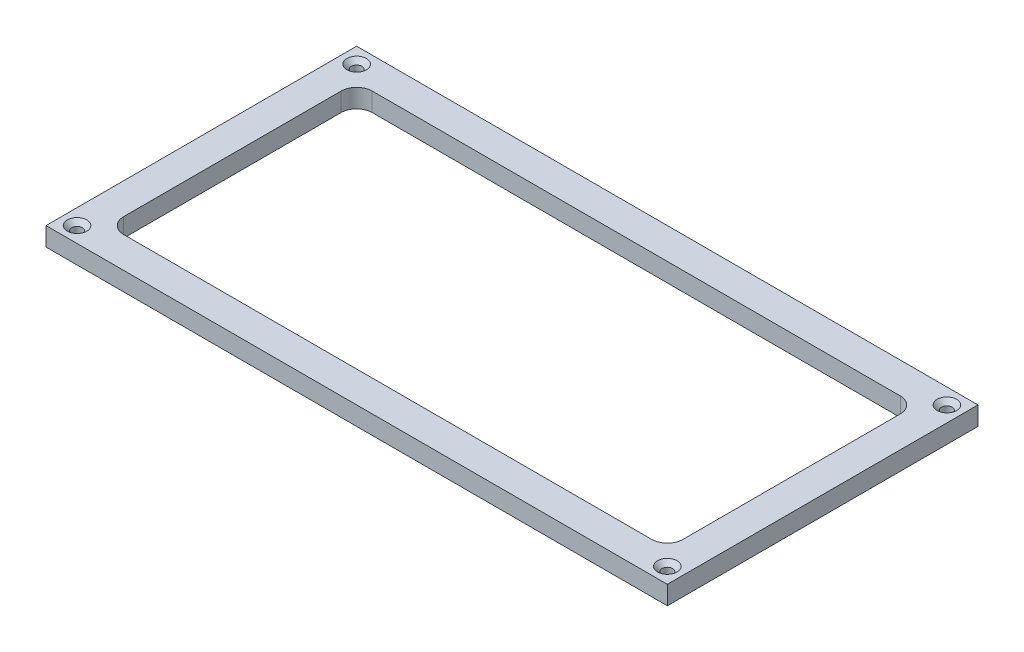
ISO-10303-21;
HEADER;
FILE_DESCRIPTION(('STEP AP214'),'2;1');
FILE_NAME('part.step','',(''),(''),'','','');
FILE_SCHEMA(('AUTOMOTIVE_DESIGN { 1 0 10303 214 1 1 1 1 }'));
ENDSEC;
DATA;
#1=APPLICATION_CONTEXT('core data for automotive mechanical design processes');
#2=APPLICATION_PROTOCOL_DEFINITION('international standard','automotive_design',2000,#1);
#3=PRODUCT_CONTEXT('',#1,'mechanical');
#4=PRODUCT('Part','Part','',(#3));
#5=PRODUCT_RELATED_PRODUCT_CATEGORY('part','',(#4));
#6=PRODUCT_DEFINITION_FORMATION('','',#4);
#7=PRODUCT_DEFINITION_CONTEXT('part definition',#1,'design');
#8=PRODUCT_DEFINITION('design','',#6,#7);
#9=PRODUCT_DEFINITION_SHAPE('','',#8);
#10=(LENGTH_UNIT() NAMED_UNIT(*) SI_UNIT(.MILLI.,.METRE.));
#11=(NAMED_UNIT(*) PLANE_ANGLE_UNIT() SI_UNIT($,.RADIAN.));
#12=(NAMED_UNIT(*) SI_UNIT($,.STERADIAN.) SOLID_ANGLE_UNIT());
#13=UNCERTAINTY_MEASURE_WITH_UNIT(LENGTH_MEASURE(1.E-05),#10,'distance_accuracy_value','');
#14=(GEOMETRIC_REPRESENTATION_CONTEXT(3) GLOBAL_UNCERTAINTY_ASSIGNED_CONTEXT((#13)) GLOBAL_UNIT_ASSIGNED_CONTEXT((#10,
#11,#12)) REPRESENTATION_CONTEXT('',''));
#15=CARTESIAN_POINT('',(0.,0.,0.));
#16=DIRECTION('',(0.,0.,1.));
#17=DIRECTION('',(1.,0.,0.));
#18=AXIS2_PLACEMENT_3D('',#15,#16,#17);
#19=CARTESIAN_POINT('',(0.,6.,0.));
#20=DIRECTION('',(1.,0.,0.));
#21=DIRECTION('',(0.,0.,-1.));
#22=AXIS2_PLACEMENT_3D('',#19,#20,#21);
#23=PLANE('',#22);
#24=DIRECTION('',(0.,0.,1.));
#25=VECTOR('',#24,1.);
#26=CARTESIAN_POINT('',(0.,0.,0.));
#27=LINE('',#26,#25);
#28=CARTESIAN_POINT('',(0.,0.,-100.));
#29=VERTEX_POINT('',#28);
#30=CARTESIAN_POINT('',(0.,0.,0.));
#31=VERTEX_POINT('',#30);
#32=EDGE_CURVE('E146',#29,#31,#27,.T.);
#33=ORIENTED_EDGE('',*,*,#32,.T.);
#34=DIRECTION('',(0.,-1.,0.));
#35=VECTOR('',#34,1.);
#36=CARTESIAN_POINT('',(0.,6.,0.));
#37=LINE('',#36,#35);
#38=CARTESIAN_POINT('',(0.,6.,0.));
#39=VERTEX_POINT('',#38);
#40=EDGE_CURVE('E127',#39,#31,#37,.T.);
#41=ORIENTED_EDGE('',*,*,#40,.F.);
#42=DIRECTION('',(0.,0.,1.));
#43=VECTOR('',#42,1.);
#44=CARTESIAN_POINT('',(0.,6.,0.));
#45=LINE('',#44,#43);
#46=CARTESIAN_POINT('',(0.,6.,-100.));
#47=VERTEX_POINT('',#46);
#48=EDGE_CURVE('E134',#47,#39,#45,.T.);
#49=ORIENTED_EDGE('',*,*,#48,.F.);
#50=DIRECTION('',(0.,-1.,0.));
#51=VECTOR('',#50,1.);
#52=CARTESIAN_POINT('',(0.,6.,-100.));
#53=LINE('',#52,#51);
#54=EDGE_CURVE('E224',#47,#29,#53,.T.);
#55=ORIENTED_EDGE('',*,*,#54,.T.);
#56=EDGE_LOOP('',(#33,#41,#49,#55));
#57=FACE_BOUND('',#56,.T.);
#58=ADVANCED_FACE('F33',(#57),#23,.F.);
#59=CARTESIAN_POINT('',(0.,6.,0.));
#60=DIRECTION('',(0.,0.,-1.));
#61=DIRECTION('',(-1.,0.,0.));
#62=AXIS2_PLACEMENT_3D('',#59,#60,#61);
#63=PLANE('',#62);
#64=DIRECTION('',(1.,0.,0.));
#65=VECTOR('',#64,1.);
#66=CARTESIAN_POINT('',(0.,0.,0.));
#67=LINE('',#66,#65);
#68=CARTESIAN_POINT('',(200.,0.,0.));
#69=VERTEX_POINT('',#68);
#70=EDGE_CURVE('E226',#31,#69,#67,.T.);
#71=ORIENTED_EDGE('',*,*,#70,.T.);
#72=DIRECTION('',(0.,-1.,0.));
#73=VECTOR('',#72,1.);
#74=CARTESIAN_POINT('',(200.,6.,0.));
#75=LINE('',#74,#73);
#76=CARTESIAN_POINT('',(200.,6.,0.));
#77=VERTEX_POINT('',#76);
#78=EDGE_CURVE('E130',#77,#69,#75,.T.);
#79=ORIENTED_EDGE('',*,*,#78,.F.);
#80=DIRECTION('',(1.,0.,0.));
#81=VECTOR('',#80,1.);
#82=CARTESIAN_POINT('',(0.,6.,0.));
#83=LINE('',#82,#81);
#84=EDGE_CURVE('E123',#39,#77,#83,.T.);
#85=ORIENTED_EDGE('',*,*,#84,.F.);
#86=ORIENTED_EDGE('',*,*,#40,.T.);
#87=EDGE_LOOP('',(#71,#79,#85,#86));
#88=FACE_BOUND('',#87,.T.);
#89=ADVANCED_FACE('F125',(#88),#63,.F.);
#90=CARTESIAN_POINT('',(200.,6.,0.));
#91=DIRECTION('',(-1.,0.,0.));
#92=DIRECTION('',(0.,0.,1.));
#93=AXIS2_PLACEMENT_3D('',#90,#91,#92);
#94=PLANE('',#93);
#95=DIRECTION('',(0.,0.,-1.));
#96=VECTOR('',#95,1.);
#97=CARTESIAN_POINT('',(200.,0.,0.));
#98=LINE('',#97,#96);
#99=CARTESIAN_POINT('',(200.,0.,-100.));
#100=VERTEX_POINT('',#99);
#101=EDGE_CURVE('E228',#69,#100,#98,.T.);
#102=ORIENTED_EDGE('',*,*,#101,.T.);
#103=DIRECTION('',(0.,-1.,0.));
#104=VECTOR('',#103,1.);
#105=CARTESIAN_POINT('',(200.,6.,-100.));
#106=LINE('',#105,#104);
#107=CARTESIAN_POINT('',(200.,6.,-100.));
#108=VERTEX_POINT('',#107);
#109=EDGE_CURVE('E151',#108,#100,#106,.T.);
#110=ORIENTED_EDGE('',*,*,#109,.F.);
#111=DIRECTION('',(0.,0.,-1.));
#112=VECTOR('',#111,1.);
#113=CARTESIAN_POINT('',(200.,6.,0.));
#114=LINE('',#113,#112);
#115=EDGE_CURVE('E133',#77,#108,#114,.T.);
#116=ORIENTED_EDGE('',*,*,#115,.F.);
#117=ORIENTED_EDGE('',*,*,#78,.T.);
#118=EDGE_LOOP('',(#102,#110,#116,#117));
#119=FACE_BOUND('',#118,.T.);
#120=ADVANCED_FACE('F238',(#119),#94,.F.);
#121=CARTESIAN_POINT('',(0.,6.,-100.));
#122=DIRECTION('',(0.,0.,1.));
#123=DIRECTION('',(1.,0.,0.));
#124=AXIS2_PLACEMENT_3D('',#121,#122,#123);
#125=PLANE('',#124);
#126=DIRECTION('',(-1.,0.,0.));
#127=VECTOR('',#126,1.);
#128=CARTESIAN_POINT('',(0.,0.,-100.));
#129=LINE('',#128,#127);
#130=EDGE_CURVE('E143',#100,#29,#129,.T.);
#131=ORIENTED_EDGE('',*,*,#130,.T.);
#132=ORIENTED_EDGE('',*,*,#54,.F.);
#133=DIRECTION('',(-1.,0.,0.));
#134=VECTOR('',#133,1.);
#135=CARTESIAN_POINT('',(0.,6.,-100.));
#136=LINE('',#135,#134);
#137=EDGE_CURVE('E139',#108,#47,#136,.T.);
#138=ORIENTED_EDGE('',*,*,#137,.F.);
#139=ORIENTED_EDGE('',*,*,#109,.T.);
#140=EDGE_LOOP('',(#131,#132,#138,#139));
#141=FACE_BOUND('',#140,.T.);
#142=ADVANCED_FACE('F235',(#141),#125,.F.);
#143=CARTESIAN_POINT('',(0.,6.,0.));
#144=DIRECTION('',(0.,-1.,0.));
#145=DIRECTION('',(0.,0.,-1.));
#146=AXIS2_PLACEMENT_3D('',#143,#144,#145);
#147=PLANE('',#146);
#148=CARTESIAN_POINT('',(5.,6.,-5.));
#149=DIRECTION('',(0.,1.,0.));
#150=DIRECTION('',(0.,0.,1.));
#151=AXIS2_PLACEMENT_3D('',#148,#149,#150);
#152=CIRCLE('',#151,3.15);
#153=CARTESIAN_POINT('',(5.,6.,-1.85));
#154=VERTEX_POINT('',#153);
#155=EDGE_CURVE('E336',#154,#154,#152,.T.);
#156=ORIENTED_EDGE('',*,*,#155,.F.);
#157=EDGE_LOOP('',(#156));
#158=FACE_BOUND('',#157,.T.);
#159=CARTESIAN_POINT('',(5.,6.,-95.));
#160=DIRECTION('',(0.,1.,0.));
#161=DIRECTION('',(0.,0.,1.));
#162=AXIS2_PLACEMENT_3D('',#159,#160,#161);
#163=CIRCLE('',#162,3.15);
#164=CARTESIAN_POINT('',(5.,6.,-91.85));
#165=VERTEX_POINT('',#164);
#166=EDGE_CURVE('E329',#165,#165,#163,.T.);
#167=ORIENTED_EDGE('',*,*,#166,.F.);
#168=EDGE_LOOP('',(#167));
#169=FACE_BOUND('',#168,.T.);
#170=CARTESIAN_POINT('',(195.,6.,-95.));
#171=DIRECTION('',(0.,1.,0.));
#172=DIRECTION('',(0.,0.,1.));
#173=AXIS2_PLACEMENT_3D('',#170,#171,#172);
#174=CIRCLE('',#173,3.14999999999999);
#175=CARTESIAN_POINT('',(195.,6.,-91.85));
#176=VERTEX_POINT('',#175);
#177=EDGE_CURVE('E322',#176,#176,#174,.T.);
#178=ORIENTED_EDGE('',*,*,#177,.F.);
#179=EDGE_LOOP('',(#178));
#180=FACE_BOUND('',#179,.T.);
#181=CARTESIAN_POINT('',(195.,6.,-5.));
#182=DIRECTION('',(0.,1.,0.));
#183=DIRECTION('',(0.,0.,1.));
#184=AXIS2_PLACEMENT_3D('',#181,#182,#183);
#185=CIRCLE('',#184,3.14999999999999);
#186=CARTESIAN_POINT('',(195.,6.,-1.85000000000001));
#187=VERTEX_POINT('',#186);
#188=EDGE_CURVE('E312',#187,#187,#185,.T.);
#189=ORIENTED_EDGE('',*,*,#188,.F.);
#190=EDGE_LOOP('',(#189));
#191=FACE_BOUND('',#190,.T.);
#192=DIRECTION('',(1.,0.,0.));
#193=VECTOR('',#192,1.);
#194=CARTESIAN_POINT('',(10.,6.,-10.));
#195=LINE('',#194,#193);
#196=CARTESIAN_POINT('',(15.,6.,-10.));
#197=VERTEX_POINT('',#196);
#198=CARTESIAN_POINT('',(185.,6.,-10.));
#199=VERTEX_POINT('',#198);
#200=EDGE_CURVE('E217',#197,#199,#195,.T.);
#201=ORIENTED_EDGE('',*,*,#200,.F.);
#202=CARTESIAN_POINT('',(15.,6.,-15.));
#203=DIRECTION('',(0.,-1.,0.));
#204=DIRECTION('',(0.,0.,-1.));
#205=AXIS2_PLACEMENT_3D('',#202,#203,#204);
#206=CIRCLE('',#205,5.);
#207=CARTESIAN_POINT('',(10.,6.,-15.));
#208=VERTEX_POINT('',#207);
#209=EDGE_CURVE('E171',#197,#208,#206,.T.);
#210=ORIENTED_EDGE('',*,*,#209,.T.);
#211=DIRECTION('',(0.,0.,1.));
#212=VECTOR('',#211,1.);
#213=CARTESIAN_POINT('',(10.,6.,-90.));
#214=LINE('',#213,#212);
#215=CARTESIAN_POINT('',(10.,6.,-85.));
#216=VERTEX_POINT('',#215);
#217=EDGE_CURVE('E187',#216,#208,#214,.T.);
#218=ORIENTED_EDGE('',*,*,#217,.F.);
#219=CARTESIAN_POINT('',(15.,6.,-85.));
#220=DIRECTION('',(0.,-1.,0.));
#221=DIRECTION('',(0.,0.,-1.));
#222=AXIS2_PLACEMENT_3D('',#219,#220,#221);
#223=CIRCLE('',#222,5.);
#224=CARTESIAN_POINT('',(15.,6.,-90.));
#225=VERTEX_POINT('',#224);
#226=EDGE_CURVE('E41',#216,#225,#223,.T.);
#227=ORIENTED_EDGE('',*,*,#226,.T.);
#228=DIRECTION('',(-1.,0.,0.));
#229=VECTOR('',#228,1.);
#230=CARTESIAN_POINT('',(10.,6.,-90.));
#231=LINE('',#230,#229);
#232=CARTESIAN_POINT('',(185.,6.,-90.));
#233=VERTEX_POINT('',#232);
#234=EDGE_CURVE('E185',#233,#225,#231,.T.);
#235=ORIENTED_EDGE('',*,*,#234,.F.);
#236=CARTESIAN_POINT('',(185.,6.,-85.));
#237=DIRECTION('',(0.,-1.,0.));
#238=DIRECTION('',(0.,0.,-1.));
#239=AXIS2_PLACEMENT_3D('',#236,#237,#238);
#240=CIRCLE('',#239,5.);
#241=CARTESIAN_POINT('',(190.,6.,-85.));
#242=VERTEX_POINT('',#241);
#243=EDGE_CURVE('E179',#233,#242,#240,.T.);
#244=ORIENTED_EDGE('',*,*,#243,.T.);
#245=DIRECTION('',(0.,0.,-1.));
#246=VECTOR('',#245,1.);
#247=CARTESIAN_POINT('',(190.,6.,-90.));
#248=LINE('',#247,#246);
#249=CARTESIAN_POINT('',(190.,6.,-15.));
#250=VERTEX_POINT('',#249);
#251=EDGE_CURVE('E193',#250,#242,#248,.T.);
#252=ORIENTED_EDGE('',*,*,#251,.F.);
#253=CARTESIAN_POINT('',(185.,6.,-15.));
#254=DIRECTION('',(0.,-1.,0.));
#255=DIRECTION('',(0.,0.,-1.));
#256=AXIS2_PLACEMENT_3D('',#253,#254,#255);
#257=CIRCLE('',#256,5.);
#258=EDGE_CURVE('E175',#250,#199,#257,.T.);
#259=ORIENTED_EDGE('',*,*,#258,.T.);
#260=EDGE_LOOP('',(#201,#210,#218,#227,#235,#244,#252,#259));
#261=FACE_BOUND('',#260,.T.);
#262=ORIENTED_EDGE('',*,*,#48,.T.);
#263=ORIENTED_EDGE('',*,*,#84,.T.);
#264=ORIENTED_EDGE('',*,*,#115,.T.);
#265=ORIENTED_EDGE('',*,*,#137,.T.);
#266=EDGE_LOOP('',(#262,#263,#264,#265));
#267=FACE_BOUND('',#266,.T.);
#268=ADVANCED_FACE('F137',(#158,#169,#180,#191,#261,#267),#147,.F.);
#269=CARTESIAN_POINT('',(0.,0.,0.));
#270=DIRECTION('',(0.,-1.,0.));
#271=DIRECTION('',(0.,0.,-1.));
#272=AXIS2_PLACEMENT_3D('',#269,#270,#271);
#273=PLANE('',#272);
#274=CARTESIAN_POINT('',(5.,0.,-5.));
#275=DIRECTION('',(0.,1.,0.));
#276=DIRECTION('',(0.,0.,1.));
#277=AXIS2_PLACEMENT_3D('',#274,#275,#276);
#278=CIRCLE('',#277,1.7);
#279=CARTESIAN_POINT('',(5.,0.,-3.3));
#280=VERTEX_POINT('',#279);
#281=EDGE_CURVE('E298',#280,#280,#278,.T.);
#282=ORIENTED_EDGE('',*,*,#281,.T.);
#283=EDGE_LOOP('',(#282));
#284=FACE_BOUND('',#283,.T.);
#285=CARTESIAN_POINT('',(5.,0.,-95.));
#286=DIRECTION('',(0.,1.,0.));
#287=DIRECTION('',(0.,0.,1.));
#288=AXIS2_PLACEMENT_3D('',#285,#286,#287);
#289=CIRCLE('',#288,1.7);
#290=CARTESIAN_POINT('',(5.,0.,-93.3));
#291=VERTEX_POINT('',#290);
#292=EDGE_CURVE('E302',#291,#291,#289,.T.);
#293=ORIENTED_EDGE('',*,*,#292,.T.);
#294=EDGE_LOOP('',(#293));
#295=FACE_BOUND('',#294,.T.);
#296=CARTESIAN_POINT('',(195.,0.,-95.));
#297=DIRECTION('',(0.,1.,0.));
#298=DIRECTION('',(0.,0.,1.));
#299=AXIS2_PLACEMENT_3D('',#296,#297,#298);
#300=CIRCLE('',#299,1.70000000000001);
#301=CARTESIAN_POINT('',(195.,0.,-93.3));
#302=VERTEX_POINT('',#301);
#303=EDGE_CURVE('E306',#302,#302,#300,.T.);
#304=ORIENTED_EDGE('',*,*,#303,.T.);
#305=EDGE_LOOP('',(#304));
#306=FACE_BOUND('',#305,.T.);
#307=CARTESIAN_POINT('',(195.,0.,-5.));
#308=DIRECTION('',(0.,1.,0.));
#309=DIRECTION('',(0.,0.,1.));
#310=AXIS2_PLACEMENT_3D('',#307,#308,#309);
#311=CIRCLE('',#310,1.70000000000001);
#312=CARTESIAN_POINT('',(195.,0.,-3.29999999999999));
#313=VERTEX_POINT('',#312);
#314=EDGE_CURVE('E211',#313,#313,#311,.T.);
#315=ORIENTED_EDGE('',*,*,#314,.T.);
#316=EDGE_LOOP('',(#315));
#317=FACE_BOUND('',#316,.T.);
#318=DIRECTION('',(-1.,0.,0.));
#319=VECTOR('',#318,1.);
#320=CARTESIAN_POINT('',(10.,0.,-90.));
#321=LINE('',#320,#319);
#322=CARTESIAN_POINT('',(185.,0.,-90.));
#323=VERTEX_POINT('',#322);
#324=CARTESIAN_POINT('',(15.,0.,-90.));
#325=VERTEX_POINT('',#324);
#326=EDGE_CURVE('E201',#323,#325,#321,.T.);
#327=ORIENTED_EDGE('',*,*,#326,.T.);
#328=CARTESIAN_POINT('',(15.,0.,-85.));
#329=DIRECTION('',(0.,-1.,0.));
#330=DIRECTION('',(0.,0.,-1.));
#331=AXIS2_PLACEMENT_3D('',#328,#329,#330);
#332=CIRCLE('',#331,5.);
#333=CARTESIAN_POINT('',(10.,0.,-85.));
#334=VERTEX_POINT('',#333);
#335=EDGE_CURVE('E11',#325,#334,#332,.F.);
#336=ORIENTED_EDGE('',*,*,#335,.T.);
#337=DIRECTION('',(0.,0.,1.));
#338=VECTOR('',#337,1.);
#339=CARTESIAN_POINT('',(10.,0.,-90.));
#340=LINE('',#339,#338);
#341=CARTESIAN_POINT('',(10.,0.,-15.));
#342=VERTEX_POINT('',#341);
#343=EDGE_CURVE('E192',#334,#342,#340,.T.);
#344=ORIENTED_EDGE('',*,*,#343,.T.);
#345=CARTESIAN_POINT('',(15.,0.,-15.));
#346=DIRECTION('',(0.,-1.,0.));
#347=DIRECTION('',(0.,0.,-1.));
#348=AXIS2_PLACEMENT_3D('',#345,#346,#347);
#349=CIRCLE('',#348,5.);
#350=CARTESIAN_POINT('',(15.,0.,-10.));
#351=VERTEX_POINT('',#350);
#352=EDGE_CURVE('E173',#342,#351,#349,.F.);
#353=ORIENTED_EDGE('',*,*,#352,.T.);
#354=DIRECTION('',(1.,0.,0.));
#355=VECTOR('',#354,1.);
#356=CARTESIAN_POINT('',(10.,0.,-10.));
#357=LINE('',#356,#355);
#358=CARTESIAN_POINT('',(185.,0.,-10.));
#359=VERTEX_POINT('',#358);
#360=EDGE_CURVE('E205',#351,#359,#357,.T.);
#361=ORIENTED_EDGE('',*,*,#360,.T.);
#362=CARTESIAN_POINT('',(185.,0.,-15.));
#363=DIRECTION('',(0.,-1.,0.));
#364=DIRECTION('',(0.,0.,-1.));
#365=AXIS2_PLACEMENT_3D('',#362,#363,#364);
#366=CIRCLE('',#365,5.);
#367=CARTESIAN_POINT('',(190.,0.,-15.));
#368=VERTEX_POINT('',#367);
#369=EDGE_CURVE('E177',#359,#368,#366,.F.);
#370=ORIENTED_EDGE('',*,*,#369,.T.);
#371=DIRECTION('',(0.,0.,-1.));
#372=VECTOR('',#371,1.);
#373=CARTESIAN_POINT('',(190.,0.,-90.));
#374=LINE('',#373,#372);
#375=CARTESIAN_POINT('',(190.,0.,-85.));
#376=VERTEX_POINT('',#375);
#377=EDGE_CURVE('E208',#368,#376,#374,.T.);
#378=ORIENTED_EDGE('',*,*,#377,.T.);
#379=CARTESIAN_POINT('',(185.,0.,-85.));
#380=DIRECTION('',(0.,-1.,0.));
#381=DIRECTION('',(0.,0.,-1.));
#382=AXIS2_PLACEMENT_3D('',#379,#380,#381);
#383=CIRCLE('',#382,5.);
#384=EDGE_CURVE('E55',#376,#323,#383,.F.);
#385=ORIENTED_EDGE('',*,*,#384,.T.);
#386=EDGE_LOOP('',(#327,#336,#344,#353,#361,#370,#378,#385));
#387=FACE_BOUND('',#386,.T.);
#388=ORIENTED_EDGE('',*,*,#32,.F.);
#389=ORIENTED_EDGE('',*,*,#130,.F.);
#390=ORIENTED_EDGE('',*,*,#101,.F.);
#391=ORIENTED_EDGE('',*,*,#70,.F.);
#392=EDGE_LOOP('',(#388,#389,#390,#391));
#393=FACE_BOUND('',#392,.T.);
#394=ADVANCED_FACE('F198',(#284,#295,#306,#317,#387,#393),#273,.T.);
#395=CARTESIAN_POINT('',(10.,0.,-90.));
#396=DIRECTION('',(-1.,0.,0.));
#397=DIRECTION('',(0.,0.,1.));
#398=AXIS2_PLACEMENT_3D('',#395,#396,#397);
#399=PLANE('',#398);
#400=ORIENTED_EDGE('',*,*,#217,.T.);
#401=DIRECTION('',(0.,1.,0.));
#402=VECTOR('',#401,1.);
#403=CARTESIAN_POINT('',(10.,0.,-15.));
#404=LINE('',#403,#402);
#405=EDGE_CURVE('E160',#208,#342,#404,.F.);
#406=ORIENTED_EDGE('',*,*,#405,.T.);
#407=ORIENTED_EDGE('',*,*,#343,.F.);
#408=DIRECTION('',(0.,1.,0.));
#409=VECTOR('',#408,1.);
#410=CARTESIAN_POINT('',(10.,6.,-85.));
#411=LINE('',#410,#409);
#412=EDGE_CURVE('E157',#334,#216,#411,.T.);
#413=ORIENTED_EDGE('',*,*,#412,.T.);
#414=EDGE_LOOP('',(#400,#406,#407,#413));
#415=FACE_BOUND('',#414,.T.);
#416=ADVANCED_FACE('F203',(#415),#399,.F.);
#417=CARTESIAN_POINT('',(10.,0.,-90.));
#418=DIRECTION('',(0.,0.,-1.));
#419=DIRECTION('',(-1.,0.,0.));
#420=AXIS2_PLACEMENT_3D('',#417,#418,#419);
#421=PLANE('',#420);
#422=ORIENTED_EDGE('',*,*,#326,.F.);
#423=DIRECTION('',(0.,1.,0.));
#424=VECTOR('',#423,1.);
#425=CARTESIAN_POINT('',(185.,6.,-90.));
#426=LINE('',#425,#424);
#427=EDGE_CURVE('E168',#323,#233,#426,.T.);
#428=ORIENTED_EDGE('',*,*,#427,.T.);
#429=ORIENTED_EDGE('',*,*,#234,.T.);
#430=DIRECTION('',(0.,1.,0.));
#431=VECTOR('',#430,1.);
#432=CARTESIAN_POINT('',(15.,0.,-90.));
#433=LINE('',#432,#431);
#434=EDGE_CURVE('E48',#225,#325,#433,.F.);
#435=ORIENTED_EDGE('',*,*,#434,.T.);
#436=EDGE_LOOP('',(#422,#428,#429,#435));
#437=FACE_BOUND('',#436,.T.);
#438=ADVANCED_FACE('F190',(#437),#421,.F.);
#439=CARTESIAN_POINT('',(190.,0.,-90.));
#440=DIRECTION('',(1.,0.,0.));
#441=DIRECTION('',(0.,0.,-1.));
#442=AXIS2_PLACEMENT_3D('',#439,#440,#441);
#443=PLANE('',#442);
#444=ORIENTED_EDGE('',*,*,#377,.F.);
#445=DIRECTION('',(0.,1.,0.));
#446=VECTOR('',#445,1.);
#447=CARTESIAN_POINT('',(190.,6.,-15.));
#448=LINE('',#447,#446);
#449=EDGE_CURVE('E164',#368,#250,#448,.T.);
#450=ORIENTED_EDGE('',*,*,#449,.T.);
#451=ORIENTED_EDGE('',*,*,#251,.T.);
#452=DIRECTION('',(0.,1.,0.));
#453=VECTOR('',#452,1.);
#454=CARTESIAN_POINT('',(190.,0.,-85.));
#455=LINE('',#454,#453);
#456=EDGE_CURVE('E162',#242,#376,#455,.F.);
#457=ORIENTED_EDGE('',*,*,#456,.T.);
#458=EDGE_LOOP('',(#444,#450,#451,#457));
#459=FACE_BOUND('',#458,.T.);
#460=ADVANCED_FACE('F271',(#459),#443,.F.);
#461=CARTESIAN_POINT('',(10.,0.,-10.));
#462=DIRECTION('',(0.,0.,1.));
#463=DIRECTION('',(1.,0.,0.));
#464=AXIS2_PLACEMENT_3D('',#461,#462,#463);
#465=PLANE('',#464);
#466=ORIENTED_EDGE('',*,*,#360,.F.);
#467=DIRECTION('',(0.,1.,0.));
#468=VECTOR('',#467,1.);
#469=CARTESIAN_POINT('',(15.,6.,-10.));
#470=LINE('',#469,#468);
#471=EDGE_CURVE('E149',#351,#197,#470,.T.);
#472=ORIENTED_EDGE('',*,*,#471,.T.);
#473=ORIENTED_EDGE('',*,*,#200,.T.);
#474=DIRECTION('',(0.,1.,0.));
#475=VECTOR('',#474,1.);
#476=CARTESIAN_POINT('',(185.,0.,-10.));
#477=LINE('',#476,#475);
#478=EDGE_CURVE('E147',#199,#359,#477,.F.);
#479=ORIENTED_EDGE('',*,*,#478,.T.);
#480=EDGE_LOOP('',(#466,#472,#473,#479));
#481=FACE_BOUND('',#480,.T.);
#482=ADVANCED_FACE('F256',(#481),#465,.F.);
#483=CARTESIAN_POINT('',(15.,0.,-15.));
#484=DIRECTION('',(0.,-1.,0.));
#485=DIRECTION('',(0.,0.,-1.));
#486=AXIS2_PLACEMENT_3D('',#483,#484,#485);
#487=CYLINDRICAL_SURFACE('',#486,5.);
#488=ORIENTED_EDGE('',*,*,#352,.F.);
#489=ORIENTED_EDGE('',*,*,#405,.F.);
#490=ORIENTED_EDGE('',*,*,#209,.F.);
#491=ORIENTED_EDGE('',*,*,#471,.F.);
#492=EDGE_LOOP('',(#488,#489,#490,#491));
#493=FACE_BOUND('',#492,.T.);
#494=ADVANCED_FACE('F252',(#493),#487,.F.);
#495=CARTESIAN_POINT('',(185.,0.,-15.));
#496=DIRECTION('',(0.,-1.,0.));
#497=DIRECTION('',(0.,0.,-1.));
#498=AXIS2_PLACEMENT_3D('',#495,#496,#497);
#499=CYLINDRICAL_SURFACE('',#498,5.);
#500=ORIENTED_EDGE('',*,*,#369,.F.);
#501=ORIENTED_EDGE('',*,*,#478,.F.);
#502=ORIENTED_EDGE('',*,*,#258,.F.);
#503=ORIENTED_EDGE('',*,*,#449,.F.);
#504=EDGE_LOOP('',(#500,#501,#502,#503));
#505=FACE_BOUND('',#504,.T.);
#506=ADVANCED_FACE('F255',(#505),#499,.F.);
#507=CARTESIAN_POINT('',(185.,0.,-85.));
#508=DIRECTION('',(0.,-1.,0.));
#509=DIRECTION('',(0.,0.,-1.));
#510=AXIS2_PLACEMENT_3D('',#507,#508,#509);
#511=CYLINDRICAL_SURFACE('',#510,5.);
#512=ORIENTED_EDGE('',*,*,#384,.F.);
#513=ORIENTED_EDGE('',*,*,#456,.F.);
#514=ORIENTED_EDGE('',*,*,#243,.F.);
#515=ORIENTED_EDGE('',*,*,#427,.F.);
#516=EDGE_LOOP('',(#512,#513,#514,#515));
#517=FACE_BOUND('',#516,.T.);
#518=ADVANCED_FACE('F259',(#517),#511,.F.);
#519=CARTESIAN_POINT('',(15.,0.,-85.));
#520=DIRECTION('',(0.,-1.,0.));
#521=DIRECTION('',(0.,0.,-1.));
#522=AXIS2_PLACEMENT_3D('',#519,#520,#521);
#523=CYLINDRICAL_SURFACE('',#522,5.);
#524=ORIENTED_EDGE('',*,*,#335,.F.);
#525=ORIENTED_EDGE('',*,*,#434,.F.);
#526=ORIENTED_EDGE('',*,*,#226,.F.);
#527=ORIENTED_EDGE('',*,*,#412,.F.);
#528=EDGE_LOOP('',(#524,#525,#526,#527));
#529=FACE_BOUND('',#528,.T.);
#530=ADVANCED_FACE('F35',(#529),#523,.F.);
#531=CARTESIAN_POINT('',(195.,6.,-5.));
#532=DIRECTION('',(0.,1.,0.));
#533=DIRECTION('',(0.,0.,1.));
#534=AXIS2_PLACEMENT_3D('',#531,#532,#533);
#535=CYLINDRICAL_SURFACE('',#534,1.69999999999999);
#536=ORIENTED_EDGE('',*,*,#314,.F.);
#537=EDGE_LOOP('',(#536));
#538=FACE_BOUND('',#537,.T.);
#539=CARTESIAN_POINT('',(195.,4.54999999999999,-5.));
#540=DIRECTION('',(0.,1.,0.));
#541=DIRECTION('',(0.,0.,1.));
#542=AXIS2_PLACEMENT_3D('',#539,#540,#541);
#543=CIRCLE('',#542,1.69999999999998);
#544=CARTESIAN_POINT('',(195.,4.54999999999999,-3.30000000000002));
#545=VERTEX_POINT('',#544);
#546=EDGE_CURVE('E310',#545,#545,#543,.T.);
#547=ORIENTED_EDGE('',*,*,#546,.T.);
#548=EDGE_LOOP('',(#547));
#549=FACE_BOUND('',#548,.T.);
#550=ADVANCED_FACE('F266',(#538,#549),#535,.F.);
#551=CARTESIAN_POINT('',(195.,6.,-5.));
#552=DIRECTION('',(0.,1.,0.));
#553=DIRECTION('',(0.,0.,1.));
#554=AXIS2_PLACEMENT_3D('',#551,#552,#553);
#555=CONICAL_SURFACE('',#554,3.14999999999999,0.785398163397448);
#556=ORIENTED_EDGE('',*,*,#546,.F.);
#557=EDGE_LOOP('',(#556));
#558=FACE_BOUND('',#557,.T.);
#559=ORIENTED_EDGE('',*,*,#188,.T.);
#560=EDGE_LOOP('',(#559));
#561=FACE_BOUND('',#560,.T.);
#562=ADVANCED_FACE('F348',(#558,#561),#555,.F.);
#563=CARTESIAN_POINT('',(195.,6.,-95.));
#564=DIRECTION('',(0.,1.,0.));
#565=DIRECTION('',(0.,0.,1.));
#566=AXIS2_PLACEMENT_3D('',#563,#564,#565);
#567=CYLINDRICAL_SURFACE('',#566,1.69999999999999);
#568=ORIENTED_EDGE('',*,*,#303,.F.);
#569=EDGE_LOOP('',(#568));
#570=FACE_BOUND('',#569,.T.);
#571=CARTESIAN_POINT('',(195.,4.54999999999999,-95.));
#572=DIRECTION('',(0.,1.,0.));
#573=DIRECTION('',(0.,0.,1.));
#574=AXIS2_PLACEMENT_3D('',#571,#572,#573);
#575=CIRCLE('',#574,1.69999999999998);
#576=CARTESIAN_POINT('',(195.,4.54999999999999,-93.3));
#577=VERTEX_POINT('',#576);
#578=EDGE_CURVE('E319',#577,#577,#575,.T.);
#579=ORIENTED_EDGE('',*,*,#578,.T.);
#580=EDGE_LOOP('',(#579));
#581=FACE_BOUND('',#580,.T.);
#582=ADVANCED_FACE('F350',(#570,#581),#567,.F.);
#583=CARTESIAN_POINT('',(195.,6.,-95.));
#584=DIRECTION('',(0.,1.,0.));
#585=DIRECTION('',(0.,0.,1.));
#586=AXIS2_PLACEMENT_3D('',#583,#584,#585);
#587=CONICAL_SURFACE('',#586,3.14999999999999,0.785398163397448);
#588=ORIENTED_EDGE('',*,*,#578,.F.);
#589=EDGE_LOOP('',(#588));
#590=FACE_BOUND('',#589,.T.);
#591=ORIENTED_EDGE('',*,*,#177,.T.);
#592=EDGE_LOOP('',(#591));
#593=FACE_BOUND('',#592,.T.);
#594=ADVANCED_FACE('F357',(#590,#593),#587,.F.);
#595=CARTESIAN_POINT('',(5.,6.,-95.));
#596=DIRECTION('',(0.,1.,0.));
#597=DIRECTION('',(0.,0.,1.));
#598=AXIS2_PLACEMENT_3D('',#595,#596,#597);
#599=CYLINDRICAL_SURFACE('',#598,1.69999999999999);
#600=ORIENTED_EDGE('',*,*,#292,.F.);
#601=EDGE_LOOP('',(#600));
#602=FACE_BOUND('',#601,.T.);
#603=CARTESIAN_POINT('',(5.,4.54999999999999,-95.));
#604=DIRECTION('',(0.,1.,0.));
#605=DIRECTION('',(0.,0.,1.));
#606=AXIS2_PLACEMENT_3D('',#603,#604,#605);
#607=CIRCLE('',#606,1.69999999999999);
#608=CARTESIAN_POINT('',(5.,4.54999999999999,-93.3));
#609=VERTEX_POINT('',#608);
#610=EDGE_CURVE('E326',#609,#609,#607,.T.);
#611=ORIENTED_EDGE('',*,*,#610,.T.);
#612=EDGE_LOOP('',(#611));
#613=FACE_BOUND('',#612,.T.);
#614=ADVANCED_FACE('F434',(#602,#613),#599,.F.);
#615=CARTESIAN_POINT('',(5.,6.,-95.));
#616=DIRECTION('',(0.,1.,0.));
#617=DIRECTION('',(0.,0.,1.));
#618=AXIS2_PLACEMENT_3D('',#615,#616,#617);
#619=CONICAL_SURFACE('',#618,3.15,0.78539816339745);
#620=ORIENTED_EDGE('',*,*,#610,.F.);
#621=EDGE_LOOP('',(#620));
#622=FACE_BOUND('',#621,.T.);
#623=ORIENTED_EDGE('',*,*,#166,.T.);
#624=EDGE_LOOP('',(#623));
#625=FACE_BOUND('',#624,.T.);
#626=ADVANCED_FACE('F443',(#622,#625),#619,.F.);
#627=CARTESIAN_POINT('',(5.,6.,-5.));
#628=DIRECTION('',(0.,1.,0.));
#629=DIRECTION('',(0.,0.,1.));
#630=AXIS2_PLACEMENT_3D('',#627,#628,#629);
#631=CYLINDRICAL_SURFACE('',#630,1.69999999999999);
#632=ORIENTED_EDGE('',*,*,#281,.F.);
#633=EDGE_LOOP('',(#632));
#634=FACE_BOUND('',#633,.T.);
#635=CARTESIAN_POINT('',(5.,4.54999999999999,-5.));
#636=DIRECTION('',(0.,1.,0.));
#637=DIRECTION('',(0.,0.,1.));
#638=AXIS2_PLACEMENT_3D('',#635,#636,#637);
#639=CIRCLE('',#638,1.69999999999999);
#640=CARTESIAN_POINT('',(5.,4.54999999999999,-3.30000000000001));
#641=VERTEX_POINT('',#640);
#642=EDGE_CURVE('E333',#641,#641,#639,.T.);
#643=ORIENTED_EDGE('',*,*,#642,.T.);
#644=EDGE_LOOP('',(#643));
#645=FACE_BOUND('',#644,.T.);
#646=ADVANCED_FACE('F453',(#634,#645),#631,.F.);
#647=CARTESIAN_POINT('',(5.,6.,-5.));
#648=DIRECTION('',(0.,1.,0.));
#649=DIRECTION('',(0.,0.,1.));
#650=AXIS2_PLACEMENT_3D('',#647,#648,#649);
#651=CONICAL_SURFACE('',#650,3.15,0.78539816339745);
#652=ORIENTED_EDGE('',*,*,#642,.F.);
#653=EDGE_LOOP('',(#652));
#654=FACE_BOUND('',#653,.T.);
#655=ORIENTED_EDGE('',*,*,#155,.T.);
#656=EDGE_LOOP('',(#655));
#657=FACE_BOUND('',#656,.T.);
#658=ADVANCED_FACE('F340',(#654,#657),#651,.F.);
#659=CLOSED_SHELL('',(#58,#89,#120,#142,#268,#394,#416,#438,#460,#482,#494,#506,#518,#530,#550,
#562,#582,#594,#614,#626,#646,#658));
#660=MANIFOLD_SOLID_BREP('B2',#659);
#661=ADVANCED_BREP_SHAPE_REPRESENTATION('',(#18,#660),#14);
#662=SHAPE_DEFINITION_REPRESENTATION(#9,#661);
ENDSEC;
END-ISO-10303-21;
